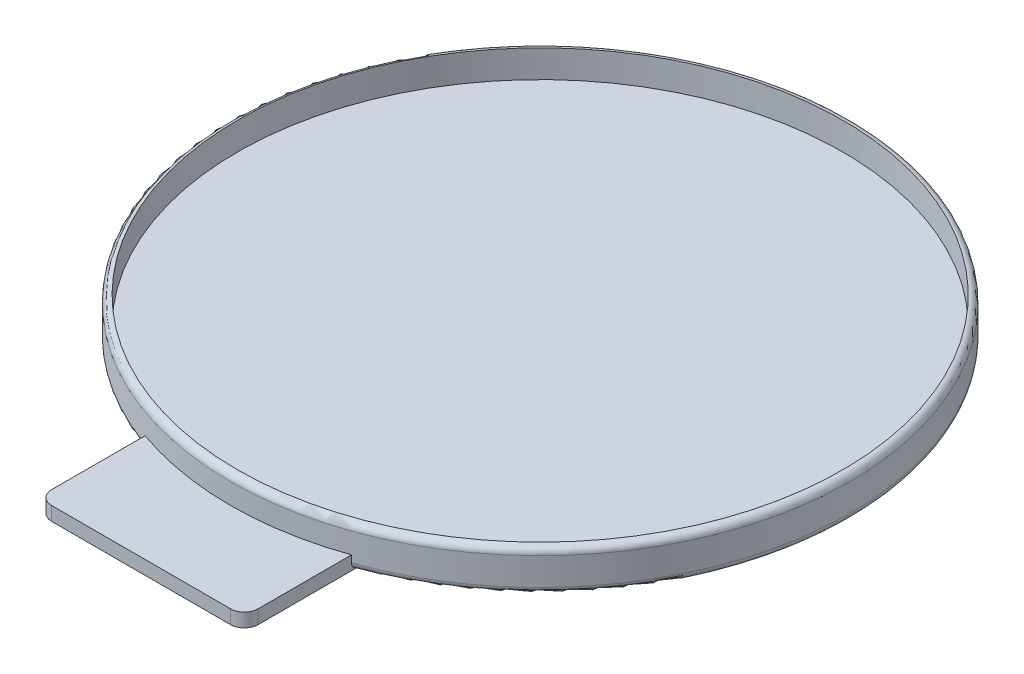
ISO-10303-21;
HEADER;
FILE_DESCRIPTION(('STEP AP214'),'2;1');
FILE_NAME('part.step','',(''),(''),'','','');
FILE_SCHEMA(('AUTOMOTIVE_DESIGN { 1 0 10303 214 1 1 1 1 }'));
ENDSEC;
DATA;
#1=APPLICATION_CONTEXT('core data for automotive mechanical design processes');
#2=APPLICATION_PROTOCOL_DEFINITION('international standard','automotive_design',2000,#1);
#3=PRODUCT_CONTEXT('',#1,'mechanical');
#4=PRODUCT('Part','Part','',(#3));
#5=PRODUCT_RELATED_PRODUCT_CATEGORY('part','',(#4));
#6=PRODUCT_DEFINITION_FORMATION('','',#4);
#7=PRODUCT_DEFINITION_CONTEXT('part definition',#1,'design');
#8=PRODUCT_DEFINITION('design','',#6,#7);
#9=PRODUCT_DEFINITION_SHAPE('','',#8);
#10=(LENGTH_UNIT() NAMED_UNIT(*) SI_UNIT(.MILLI.,.METRE.));
#11=(NAMED_UNIT(*) PLANE_ANGLE_UNIT() SI_UNIT($,.RADIAN.));
#12=(NAMED_UNIT(*) SI_UNIT($,.STERADIAN.) SOLID_ANGLE_UNIT());
#13=UNCERTAINTY_MEASURE_WITH_UNIT(LENGTH_MEASURE(1.E-05),#10,'distance_accuracy_value','');
#14=(GEOMETRIC_REPRESENTATION_CONTEXT(3) GLOBAL_UNCERTAINTY_ASSIGNED_CONTEXT((#13)) GLOBAL_UNIT_ASSIGNED_CONTEXT((#10,
#11,#12)) REPRESENTATION_CONTEXT('',''));
#15=CARTESIAN_POINT('',(0.,0.,0.));
#16=DIRECTION('',(0.,0.,1.));
#17=DIRECTION('',(1.,0.,0.));
#18=AXIS2_PLACEMENT_3D('',#15,#16,#17);
#19=CARTESIAN_POINT('',(0.,30.,0.));
#20=DIRECTION('',(0.,-1.,0.));
#21=DIRECTION('',(0.,0.,-1.));
#22=AXIS2_PLACEMENT_3D('',#19,#20,#21);
#23=CYLINDRICAL_SURFACE('',#22,225.);
#24=CARTESIAN_POINT('',(0.,25.,0.));
#25=DIRECTION('',(0.,1.,0.));
#26=DIRECTION('',(0.,0.,1.));
#27=AXIS2_PLACEMENT_3D('',#24,#25,#26);
#28=CIRCLE('',#27,225.);
#29=CARTESIAN_POINT('',(0.,25.,225.));
#30=VERTEX_POINT('',#29);
#31=EDGE_CURVE('E156',#30,#30,#28,.F.);
#32=ORIENTED_EDGE('',*,*,#31,.T.);
#33=EDGE_LOOP('',(#32));
#34=FACE_BOUND('',#33,.T.);
#35=DIRECTION('',(0.,-1.,0.));
#36=VECTOR('',#35,1.);
#37=CARTESIAN_POINT('',(75.,30.,212.132034355964));
#38=LINE('',#37,#36);
#39=CARTESIAN_POINT('',(75.,5.,212.132034355964));
#40=VERTEX_POINT('',#39);
#41=CARTESIAN_POINT('',(75.,10.,212.132034355964));
#42=VERTEX_POINT('',#41);
#43=EDGE_CURVE('E126',#40,#42,#38,.F.);
#44=ORIENTED_EDGE('',*,*,#43,.F.);
#45=CARTESIAN_POINT('',(0.,5.,0.));
#46=DIRECTION('',(0.,1.,0.));
#47=DIRECTION('',(0.,0.,1.));
#48=AXIS2_PLACEMENT_3D('',#45,#46,#47);
#49=CIRCLE('',#48,225.);
#50=CARTESIAN_POINT('',(-75.,5.,212.132034355964));
#51=VERTEX_POINT('',#50);
#52=EDGE_CURVE('E125',#40,#51,#49,.T.);
#53=ORIENTED_EDGE('',*,*,#52,.T.);
#54=DIRECTION('',(0.,-1.,0.));
#55=VECTOR('',#54,1.);
#56=CARTESIAN_POINT('',(-75.,30.,212.132034355964));
#57=LINE('',#56,#55);
#58=CARTESIAN_POINT('',(-75.,10.,212.132034355964));
#59=VERTEX_POINT('',#58);
#60=EDGE_CURVE('E111',#59,#51,#57,.T.);
#61=ORIENTED_EDGE('',*,*,#60,.F.);
#62=CARTESIAN_POINT('',(0.,10.,0.));
#63=DIRECTION('',(0.,-1.,0.));
#64=DIRECTION('',(1.,0.,0.));
#65=AXIS2_PLACEMENT_3D('',#62,#63,#64);
#66=CIRCLE('',#65,225.);
#67=EDGE_CURVE('E123',#42,#59,#66,.T.);
#68=ORIENTED_EDGE('',*,*,#67,.F.);
#69=EDGE_LOOP('',(#44,#53,#61,#68));
#70=FACE_BOUND('',#69,.T.);
#71=ADVANCED_FACE('F45',(#34,#70),#23,.T.);
#72=CARTESIAN_POINT('',(0.,0.,0.));
#73=DIRECTION('',(0.,1.,0.));
#74=DIRECTION('',(0.,0.,1.));
#75=AXIS2_PLACEMENT_3D('',#72,#73,#74);
#76=PLANE('',#75);
#77=DIRECTION('',(0.,0.,-1.));
#78=VECTOR('',#77,1.);
#79=CARTESIAN_POINT('',(-75.,0.,290.));
#80=LINE('',#79,#78);
#81=CARTESIAN_POINT('',(-75.,0.,280.));
#82=VERTEX_POINT('',#81);
#83=CARTESIAN_POINT('',(-75.,0.,206.821178799464));
#84=VERTEX_POINT('',#83);
#85=EDGE_CURVE('E65',#82,#84,#80,.T.);
#86=ORIENTED_EDGE('',*,*,#85,.T.);
#87=CARTESIAN_POINT('',(0.,0.,0.));
#88=DIRECTION('',(0.,1.,0.));
#89=DIRECTION('',(0.,0.,1.));
#90=AXIS2_PLACEMENT_3D('',#87,#88,#89);
#91=CIRCLE('',#90,220.);
#92=CARTESIAN_POINT('',(75.,0.,206.821178799464));
#93=VERTEX_POINT('',#92);
#94=EDGE_CURVE('E160',#84,#93,#91,.F.);
#95=ORIENTED_EDGE('',*,*,#94,.T.);
#96=DIRECTION('',(0.,0.,-1.));
#97=VECTOR('',#96,1.);
#98=CARTESIAN_POINT('',(75.,0.,290.));
#99=LINE('',#98,#97);
#100=CARTESIAN_POINT('',(75.,0.,280.));
#101=VERTEX_POINT('',#100);
#102=EDGE_CURVE('E72',#101,#93,#99,.T.);
#103=ORIENTED_EDGE('',*,*,#102,.F.);
#104=CARTESIAN_POINT('',(65.,0.,280.));
#105=DIRECTION('',(0.,1.,0.));
#106=DIRECTION('',(0.,0.,1.));
#107=AXIS2_PLACEMENT_3D('',#104,#105,#106);
#108=CIRCLE('',#107,10.);
#109=CARTESIAN_POINT('',(65.,0.,290.));
#110=VERTEX_POINT('',#109);
#111=EDGE_CURVE('E153',#101,#110,#108,.F.);
#112=ORIENTED_EDGE('',*,*,#111,.T.);
#113=DIRECTION('',(1.,0.,0.));
#114=VECTOR('',#113,1.);
#115=CARTESIAN_POINT('',(-75.,0.,290.));
#116=LINE('',#115,#114);
#117=CARTESIAN_POINT('',(-65.,0.,290.));
#118=VERTEX_POINT('',#117);
#119=EDGE_CURVE('E363',#118,#110,#116,.T.);
#120=ORIENTED_EDGE('',*,*,#119,.F.);
#121=CARTESIAN_POINT('',(-65.,0.,280.));
#122=DIRECTION('',(0.,1.,0.));
#123=DIRECTION('',(0.,0.,1.));
#124=AXIS2_PLACEMENT_3D('',#121,#122,#123);
#125=CIRCLE('',#124,10.);
#126=EDGE_CURVE('E151',#118,#82,#125,.F.);
#127=ORIENTED_EDGE('',*,*,#126,.T.);
#128=EDGE_LOOP('',(#86,#95,#103,#112,#120,#127));
#129=FACE_BOUND('',#128,.T.);
#130=ADVANCED_FACE('F186',(#129),#76,.F.);
#131=CARTESIAN_POINT('',(0.,10.,0.));
#132=DIRECTION('',(0.,1.,0.));
#133=DIRECTION('',(0.,0.,1.));
#134=AXIS2_PLACEMENT_3D('',#131,#132,#133);
#135=CYLINDRICAL_SURFACE('',#134,220.);
#136=CARTESIAN_POINT('',(0.,10.,0.));
#137=DIRECTION('',(0.,1.,0.));
#138=DIRECTION('',(0.,0.,1.));
#139=AXIS2_PLACEMENT_3D('',#136,#137,#138);
#140=CIRCLE('',#139,220.);
#141=CARTESIAN_POINT('',(0.,10.,220.));
#142=VERTEX_POINT('',#141);
#143=EDGE_CURVE('E133',#142,#142,#140,.T.);
#144=ORIENTED_EDGE('',*,*,#143,.F.);
#145=EDGE_LOOP('',(#144));
#146=FACE_BOUND('',#145,.T.);
#147=CARTESIAN_POINT('',(0.,30.,0.));
#148=DIRECTION('',(0.,1.,0.));
#149=DIRECTION('',(0.,0.,1.));
#150=AXIS2_PLACEMENT_3D('',#147,#148,#149);
#151=CIRCLE('',#150,220.);
#152=CARTESIAN_POINT('',(0.,30.,220.));
#153=VERTEX_POINT('',#152);
#154=EDGE_CURVE('E139',#153,#153,#151,.T.);
#155=ORIENTED_EDGE('',*,*,#154,.T.);
#156=EDGE_LOOP('',(#155));
#157=FACE_BOUND('',#156,.T.);
#158=ADVANCED_FACE('F190',(#146,#157),#135,.F.);
#159=CARTESIAN_POINT('',(0.,10.,0.));
#160=DIRECTION('',(0.,1.,0.));
#161=DIRECTION('',(0.,0.,1.));
#162=AXIS2_PLACEMENT_3D('',#159,#160,#161);
#163=PLANE('',#162);
#164=ORIENTED_EDGE('',*,*,#143,.T.);
#165=EDGE_LOOP('',(#164));
#166=FACE_BOUND('',#165,.T.);
#167=ADVANCED_FACE('F193',(#166),#163,.T.);
#168=CARTESIAN_POINT('',(75.,10.,290.));
#169=DIRECTION('',(-1.,0.,0.));
#170=DIRECTION('',(0.,0.,1.));
#171=AXIS2_PLACEMENT_3D('',#168,#169,#170);
#172=PLANE('',#171);
#173=DIRECTION('',(0.,0.,-1.));
#174=VECTOR('',#173,1.);
#175=CARTESIAN_POINT('',(75.,10.,290.));
#176=LINE('',#175,#174);
#177=CARTESIAN_POINT('',(75.,10.,280.));
#178=VERTEX_POINT('',#177);
#179=EDGE_CURVE('E117',#178,#42,#176,.T.);
#180=ORIENTED_EDGE('',*,*,#179,.F.);
#181=DIRECTION('',(0.,1.,0.));
#182=VECTOR('',#181,1.);
#183=CARTESIAN_POINT('',(75.,0.,280.));
#184=LINE('',#183,#182);
#185=EDGE_CURVE('E149',#178,#101,#184,.F.);
#186=ORIENTED_EDGE('',*,*,#185,.T.);
#187=ORIENTED_EDGE('',*,*,#102,.T.);
#188=CARTESIAN_POINT('',(75.,0.,206.821178799464));
#189=CARTESIAN_POINT('',(75.,-1.00969061985495E-05,206.977729866407));
#190=CARTESIAN_POINT('',(75.,0.00649762970377498,207.13428305928));
#191=CARTESIAN_POINT('',(75.,0.032488628740973,207.44632248279));
#192=CARTESIAN_POINT('',(75.,0.0519730754961529,207.601808615577));
#193=CARTESIAN_POINT('',(75.,0.103888957417153,207.910801836981));
#194=CARTESIAN_POINT('',(75.,0.136336116456865,208.064306287498));
#195=CARTESIAN_POINT('',(75.,0.214038059373184,208.36803511097));
#196=CARTESIAN_POINT('',(75.,0.259292330572378,208.518259614964));
#197=CARTESIAN_POINT('',(75.,0.362462798048142,208.814479330044));
#198=CARTESIAN_POINT('',(75.,0.420392385842308,208.960469881786));
#199=CARTESIAN_POINT('',(75.,0.548629402789149,209.246976814263));
#200=CARTESIAN_POINT('',(75.,0.618941178091707,209.387491251661));
#201=CARTESIAN_POINT('',(75.,0.771498804572654,209.661735530894));
#202=CARTESIAN_POINT('',(75.,0.853734526442381,209.795471002562));
#203=CARTESIAN_POINT('',(75.,1.02971905215756,210.055136476583));
#204=CARTESIAN_POINT('',(75.,1.12346710706769,210.181066985887));
#205=CARTESIAN_POINT('',(75.,1.31867536290373,210.420035559957));
#206=CARTESIAN_POINT('',(75.,1.41978509833058,210.533359887081));
#207=CARTESIAN_POINT('',(75.,1.63158496370856,210.750591134746));
#208=CARTESIAN_POINT('',(75.,1.74227112041913,210.854501924663));
#209=CARTESIAN_POINT('',(75.,1.97256201852414,211.052007114487));
#210=CARTESIAN_POINT('',(75.,2.09216960107895,211.145598204214));
#211=CARTESIAN_POINT('',(75.,2.33941560091356,211.32148698311));
#212=CARTESIAN_POINT('',(75.,2.46705338273924,211.403785564255));
#213=CARTESIAN_POINT('',(75.,2.72171071029319,211.55176806911));
#214=CARTESIAN_POINT('',(75.,2.84832941335093,211.618142402058));
#215=CARTESIAN_POINT('',(75.,3.1069189856289,211.739473623918));
#216=CARTESIAN_POINT('',(75.,3.23888942504731,211.794431427537));
#217=CARTESIAN_POINT('',(75.,3.50703985418332,211.892318953955));
#218=CARTESIAN_POINT('',(75.,3.64321457110822,211.935263113544));
#219=CARTESIAN_POINT('',(75.,3.91881406195347,212.008751232718));
#220=CARTESIAN_POINT('',(75.,4.05823744318048,212.03930040622));
#221=CARTESIAN_POINT('',(75.,4.33109976041222,212.086285423407));
#222=CARTESIAN_POINT('',(75.,4.46441565424427,212.103438232301));
#223=CARTESIAN_POINT('',(75.,4.73181910335885,212.126313436406));
#224=CARTESIAN_POINT('',(75.,4.86590517460752,212.132053196131));
#225=CARTESIAN_POINT('',(75.,5.,212.132034355964));
#226=B_SPLINE_CURVE_WITH_KNOTS('',3,(#188,#189,#190,#191,#192,#193,#194,#195,#196,#197,#198,
#199,#200,#201,#202,#203,#204,#205,#206,#207,#208,#209,#210,#211,#212,#213,#214,#215,#216,#217,
#218,#219,#220,#221,#222,#223,#224,#225),.UNSPECIFIED.,.F.,.F.,(4,2,2,2,2,2,2,2,2,2,2,2,2,2,2,2,
2,2,4),(0.,0.469521709563345,0.939085914256106,1.40922144197815,1.87933815251658,
2.34995396212251,2.82073528839804,3.29111900716552,3.76147214129494,4.21651157525627,
4.67136311129521,5.12636012515658,5.5813211788969,6.00966062110904,6.43796573093356,
6.86575391390016,7.29336196198386,7.69612181933947,8.09826842274717),.UNSPECIFIED.);
#227=EDGE_CURVE('E11',#93,#40,#226,.T.);
#228=ORIENTED_EDGE('',*,*,#227,.T.);
#229=ORIENTED_EDGE('',*,*,#43,.T.);
#230=EDGE_LOOP('',(#180,#186,#187,#228,#229));
#231=FACE_BOUND('',#230,.T.);
#232=ADVANCED_FACE('F196',(#231),#172,.F.);
#233=CARTESIAN_POINT('',(-75.,10.,290.));
#234=DIRECTION('',(1.,0.,0.));
#235=DIRECTION('',(0.,0.,-1.));
#236=AXIS2_PLACEMENT_3D('',#233,#234,#235);
#237=PLANE('',#236);
#238=ORIENTED_EDGE('',*,*,#85,.F.);
#239=DIRECTION('',(0.,-1.,0.));
#240=VECTOR('',#239,1.);
#241=CARTESIAN_POINT('',(-75.,10.,280.));
#242=LINE('',#241,#240);
#243=CARTESIAN_POINT('',(-75.,10.,280.));
#244=VERTEX_POINT('',#243);
#245=EDGE_CURVE('E113',#82,#244,#242,.F.);
#246=ORIENTED_EDGE('',*,*,#245,.T.);
#247=DIRECTION('',(0.,0.,-1.));
#248=VECTOR('',#247,1.);
#249=CARTESIAN_POINT('',(-75.,10.,290.));
#250=LINE('',#249,#248);
#251=EDGE_CURVE('E108',#244,#59,#250,.T.);
#252=ORIENTED_EDGE('',*,*,#251,.T.);
#253=ORIENTED_EDGE('',*,*,#60,.T.);
#254=CARTESIAN_POINT('',(-75.,5.,212.132034355964));
#255=CARTESIAN_POINT('',(-75.,4.86521562083205,212.132054303992));
#256=CARTESIAN_POINT('',(-75.,4.73043629326435,212.126254589784));
#257=CARTESIAN_POINT('',(-75.,4.46188700835183,212.1031617203));
#258=CARTESIAN_POINT('',(-75.,4.32811689128585,212.085870424022));
#259=CARTESIAN_POINT('',(-75.,4.0628445219683,212.039992668512));
#260=CARTESIAN_POINT('',(-75.,3.93133778562614,212.011432112191));
#261=CARTESIAN_POINT('',(-75.,3.6712117442977,211.943291891307));
#262=CARTESIAN_POINT('',(-75.,3.54259246724746,211.903712120183));
#263=CARTESIAN_POINT('',(-75.,3.28916880429026,211.813911863781));
#264=CARTESIAN_POINT('',(-75.,3.16436332088488,211.763694473332));
#265=CARTESIAN_POINT('',(-75.,2.91931425398578,211.65304414798));
#266=CARTESIAN_POINT('',(-75.,2.79907237598268,211.592607439103));
#267=CARTESIAN_POINT('',(-75.,2.5639835319808,211.46206575606));
#268=CARTESIAN_POINT('',(-75.,2.44913576592247,211.391962221796));
#269=CARTESIAN_POINT('',(-75.,2.2254722109059,211.24264022318));
#270=CARTESIAN_POINT('',(-75.,2.11665871957374,211.16341832173));
#271=CARTESIAN_POINT('',(-75.,1.90327712908855,210.994565025939));
#272=CARTESIAN_POINT('',(-75.,1.79886634353964,210.904734588776));
#273=CARTESIAN_POINT('',(-75.,1.59763131947899,210.716922959441));
#274=CARTESIAN_POINT('',(-75.,1.5008098612015,210.618938807131));
#275=CARTESIAN_POINT('',(-75.,1.2225791616285,210.313887585933));
#276=CARTESIAN_POINT('',(-75.,1.05323836793463,210.095590162124));
#277=CARTESIAN_POINT('',(-75.,0.742206952697372,209.623070392491));
#278=CARTESIAN_POINT('',(-75.,0.602516985389428,209.367540984375));
#279=CARTESIAN_POINT('',(-75.,0.365432746907469,208.837509780998));
#280=CARTESIAN_POINT('',(-75.,0.26804867501512,208.563003429165));
#281=CARTESIAN_POINT('',(-75.,0.128558384228064,208.044467379864));
#282=CARTESIAN_POINT('',(-75.,0.0803390568275681,207.802067710278));
#283=CARTESIAN_POINT('',(-75.,0.0321347790169013,207.435618009222));
#284=CARTESIAN_POINT('',(-75.,0.0200874767759428,207.313056213775));
#285=CARTESIAN_POINT('',(-75.,0.00402026265736534,207.067399422597));
#286=CARTESIAN_POINT('',(-75.,8.66501098272832E-07,206.944304393121));
#287=CARTESIAN_POINT('',(-75.,0.,206.821178799464));
#288=B_SPLINE_CURVE_WITH_KNOTS('',3,(#254,#255,#256,#257,#258,#259,#260,#261,#262,#263,#264,
#265,#266,#267,#268,#269,#270,#271,#272,#273,#274,#275,#276,#277,#278,#279,#280,#281,#282,#283,
#284,#285,#286,#287),.UNSPECIFIED.,.F.,.F.,(4,2,2,2,2,2,2,2,2,2,2,2,2,2,2,2,4),(0.,
0.404220747381107,0.808376119683716,1.21160788390601,1.61484354769737,2.01796205786358,
2.42122976533915,2.82443746966664,3.22779766089142,3.64052677324787,4.05340638277259,
4.87853921093616,5.7484758600685,6.61862212092342,7.35782593946884,7.72705198997599,
8.09630175920034),.UNSPECIFIED.);
#289=EDGE_CURVE('E58',#51,#84,#288,.T.);
#290=ORIENTED_EDGE('',*,*,#289,.T.);
#291=EDGE_LOOP('',(#238,#246,#252,#253,#290));
#292=FACE_BOUND('',#291,.T.);
#293=ADVANCED_FACE('F110',(#292),#237,.F.);
#294=CARTESIAN_POINT('',(-75.,10.,290.));
#295=DIRECTION('',(0.,-1.,0.));
#296=DIRECTION('',(1.,0.,0.));
#297=AXIS2_PLACEMENT_3D('',#294,#295,#296);
#298=PLANE('',#297);
#299=DIRECTION('',(-1.,0.,0.));
#300=VECTOR('',#299,1.);
#301=CARTESIAN_POINT('',(-75.,10.,290.));
#302=LINE('',#301,#300);
#303=CARTESIAN_POINT('',(65.,10.,290.));
#304=VERTEX_POINT('',#303);
#305=CARTESIAN_POINT('',(-65.,10.,290.));
#306=VERTEX_POINT('',#305);
#307=EDGE_CURVE('E366',#304,#306,#302,.T.);
#308=ORIENTED_EDGE('',*,*,#307,.F.);
#309=CARTESIAN_POINT('',(65.,10.,280.));
#310=DIRECTION('',(0.,-1.,0.));
#311=DIRECTION('',(1.,0.,0.));
#312=AXIS2_PLACEMENT_3D('',#309,#310,#311);
#313=CIRCLE('',#312,10.);
#314=EDGE_CURVE('E147',#304,#178,#313,.F.);
#315=ORIENTED_EDGE('',*,*,#314,.T.);
#316=ORIENTED_EDGE('',*,*,#179,.T.);
#317=ORIENTED_EDGE('',*,*,#67,.T.);
#318=ORIENTED_EDGE('',*,*,#251,.F.);
#319=CARTESIAN_POINT('',(-65.,10.,280.));
#320=DIRECTION('',(0.,-1.,0.));
#321=DIRECTION('',(1.,0.,0.));
#322=AXIS2_PLACEMENT_3D('',#319,#320,#321);
#323=CIRCLE('',#322,10.);
#324=EDGE_CURVE('E145',#244,#306,#323,.F.);
#325=ORIENTED_EDGE('',*,*,#324,.T.);
#326=EDGE_LOOP('',(#308,#315,#316,#317,#318,#325));
#327=FACE_BOUND('',#326,.T.);
#328=ADVANCED_FACE('F130',(#327),#298,.F.);
#329=CARTESIAN_POINT('',(0.,0.,290.));
#330=DIRECTION('',(0.,0.,1.));
#331=DIRECTION('',(1.,0.,0.));
#332=AXIS2_PLACEMENT_3D('',#329,#330,#331);
#333=PLANE('',#332);
#334=ORIENTED_EDGE('',*,*,#119,.T.);
#335=DIRECTION('',(0.,1.,0.));
#336=VECTOR('',#335,1.);
#337=CARTESIAN_POINT('',(65.,10.,290.));
#338=LINE('',#337,#336);
#339=EDGE_CURVE('E136',#110,#304,#338,.T.);
#340=ORIENTED_EDGE('',*,*,#339,.T.);
#341=ORIENTED_EDGE('',*,*,#307,.T.);
#342=DIRECTION('',(0.,-1.,0.));
#343=VECTOR('',#342,1.);
#344=CARTESIAN_POINT('',(-65.,0.,290.));
#345=LINE('',#344,#343);
#346=EDGE_CURVE('E132',#306,#118,#345,.T.);
#347=ORIENTED_EDGE('',*,*,#346,.T.);
#348=EDGE_LOOP('',(#334,#340,#341,#347));
#349=FACE_BOUND('',#348,.T.);
#350=ADVANCED_FACE('F182',(#349),#333,.T.);
#351=CARTESIAN_POINT('',(65.,0.,280.));
#352=DIRECTION('',(0.,-1.,0.));
#353=DIRECTION('',(0.,0.,-1.));
#354=AXIS2_PLACEMENT_3D('',#351,#352,#353);
#355=CYLINDRICAL_SURFACE('',#354,10.);
#356=ORIENTED_EDGE('',*,*,#111,.F.);
#357=ORIENTED_EDGE('',*,*,#185,.F.);
#358=ORIENTED_EDGE('',*,*,#314,.F.);
#359=ORIENTED_EDGE('',*,*,#339,.F.);
#360=EDGE_LOOP('',(#356,#357,#358,#359));
#361=FACE_BOUND('',#360,.T.);
#362=ADVANCED_FACE('F178',(#361),#355,.T.);
#363=CARTESIAN_POINT('',(-65.,0.,280.));
#364=DIRECTION('',(0.,1.,0.));
#365=DIRECTION('',(0.,0.,1.));
#366=AXIS2_PLACEMENT_3D('',#363,#364,#365);
#367=CYLINDRICAL_SURFACE('',#366,10.);
#368=ORIENTED_EDGE('',*,*,#324,.F.);
#369=ORIENTED_EDGE('',*,*,#245,.F.);
#370=ORIENTED_EDGE('',*,*,#126,.F.);
#371=ORIENTED_EDGE('',*,*,#346,.F.);
#372=EDGE_LOOP('',(#368,#369,#370,#371));
#373=FACE_BOUND('',#372,.T.);
#374=ADVANCED_FACE('F173',(#373),#367,.T.);
#375=CARTESIAN_POINT('',(0.,5.,0.));
#376=DIRECTION('',(0.,1.,0.));
#377=DIRECTION('',(0.,0.,1.));
#378=AXIS2_PLACEMENT_3D('',#375,#376,#377);
#379=TOROIDAL_SURFACE('',#378,220.,5.);
#380=ORIENTED_EDGE('',*,*,#227,.F.);
#381=ORIENTED_EDGE('',*,*,#94,.F.);
#382=ORIENTED_EDGE('',*,*,#289,.F.);
#383=ORIENTED_EDGE('',*,*,#52,.F.);
#384=EDGE_LOOP('',(#380,#381,#382,#383));
#385=FACE_BOUND('',#384,.T.);
#386=ADVANCED_FACE('F169',(#385),#379,.T.);
#387=CARTESIAN_POINT('',(0.,25.,0.));
#388=DIRECTION('',(0.,1.,0.));
#389=DIRECTION('',(0.,0.,1.));
#390=AXIS2_PLACEMENT_3D('',#387,#388,#389);
#391=TOROIDAL_SURFACE('',#390,220.,5.);
#392=ORIENTED_EDGE('',*,*,#31,.F.);
#393=EDGE_LOOP('',(#392));
#394=FACE_BOUND('',#393,.T.);
#395=ORIENTED_EDGE('',*,*,#154,.F.);
#396=EDGE_LOOP('',(#395));
#397=FACE_BOUND('',#396,.T.);
#398=ADVANCED_FACE('F47',(#394,#397),#391,.T.);
#399=CLOSED_SHELL('',(#71,#130,#158,#167,#232,#293,#328,#350,#362,#374,#386,#398));
#400=MANIFOLD_SOLID_BREP('B2',#399);
#401=ADVANCED_BREP_SHAPE_REPRESENTATION('',(#18,#400),#14);
#402=SHAPE_DEFINITION_REPRESENTATION(#9,#401);
ENDSEC;
END-ISO-10303-21;
